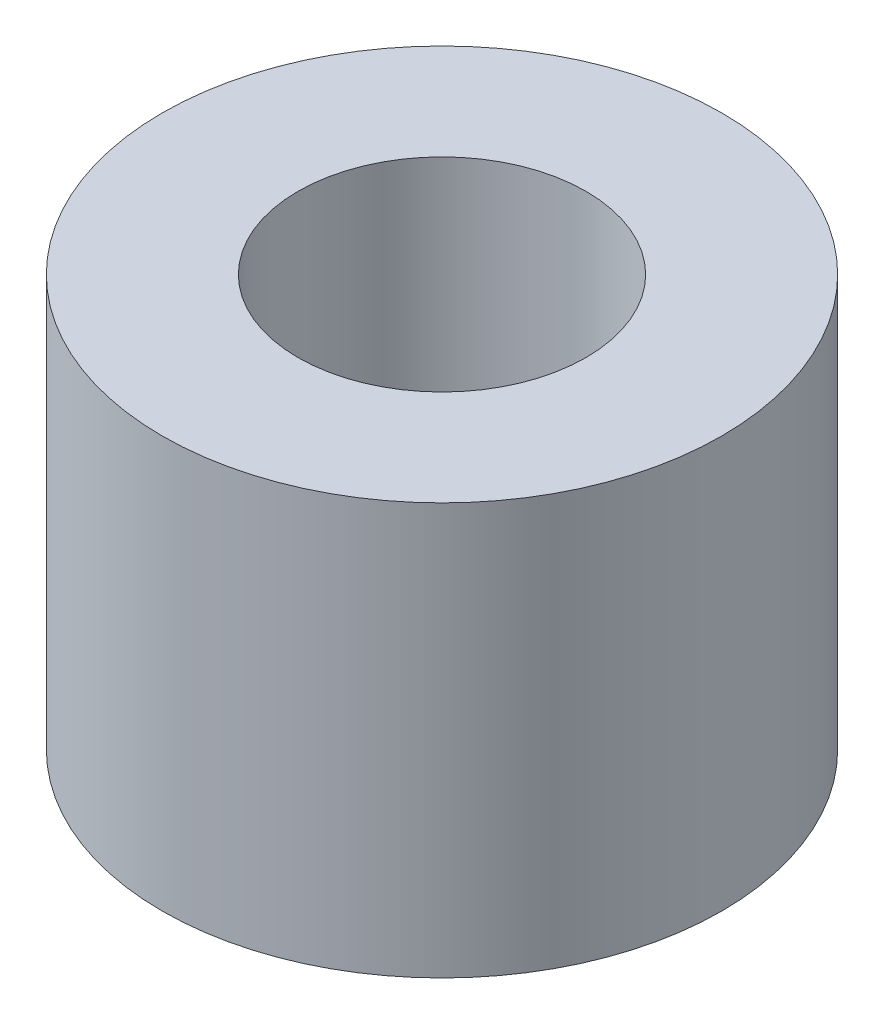
ISO-10303-21;
HEADER;
FILE_DESCRIPTION(('STEP AP214'),'2;1');
FILE_NAME('part.step','',(''),(''),'','','');
FILE_SCHEMA(('AUTOMOTIVE_DESIGN { 1 0 10303 214 1 1 1 1 }'));
ENDSEC;
DATA;
#1=APPLICATION_CONTEXT('core data for automotive mechanical design processes');
#2=APPLICATION_PROTOCOL_DEFINITION('international standard','automotive_design',2000,#1);
#3=PRODUCT_CONTEXT('',#1,'mechanical');
#4=PRODUCT('Part','Part','',(#3));
#5=PRODUCT_RELATED_PRODUCT_CATEGORY('part','',(#4));
#6=PRODUCT_DEFINITION_FORMATION('','',#4);
#7=PRODUCT_DEFINITION_CONTEXT('part definition',#1,'design');
#8=PRODUCT_DEFINITION('design','',#6,#7);
#9=PRODUCT_DEFINITION_SHAPE('','',#8);
#10=(LENGTH_UNIT() NAMED_UNIT(*) SI_UNIT(.MILLI.,.METRE.));
#11=(NAMED_UNIT(*) PLANE_ANGLE_UNIT() SI_UNIT($,.RADIAN.));
#12=(NAMED_UNIT(*) SI_UNIT($,.STERADIAN.) SOLID_ANGLE_UNIT());
#13=UNCERTAINTY_MEASURE_WITH_UNIT(LENGTH_MEASURE(1.E-05),#10,'distance_accuracy_value','');
#14=(GEOMETRIC_REPRESENTATION_CONTEXT(3) GLOBAL_UNCERTAINTY_ASSIGNED_CONTEXT((#13)) GLOBAL_UNIT_ASSIGNED_CONTEXT((#10,
#11,#12)) REPRESENTATION_CONTEXT('',''));
#15=CARTESIAN_POINT('',(0.,0.,0.));
#16=DIRECTION('',(0.,0.,1.));
#17=DIRECTION('',(1.,0.,0.));
#18=AXIS2_PLACEMENT_3D('',#15,#16,#17);
#19=CARTESIAN_POINT('',(0.,5.,0.));
#20=DIRECTION('',(0.,1.,0.));
#21=DIRECTION('',(0.,0.,1.));
#22=AXIS2_PLACEMENT_3D('',#19,#20,#21);
#23=PLANE('',#22);
#24=CARTESIAN_POINT('',(0.,5.,0.));
#25=DIRECTION('',(0.,1.,0.));
#26=DIRECTION('',(0.,0.,1.));
#27=AXIS2_PLACEMENT_3D('',#24,#25,#26);
#28=CIRCLE('',#27,3.4);
#29=CARTESIAN_POINT('',(0.,5.,3.4));
#30=VERTEX_POINT('',#29);
#31=EDGE_CURVE('E10',#30,#30,#28,.T.);
#32=ORIENTED_EDGE('',*,*,#31,.T.);
#33=EDGE_LOOP('',(#32));
#34=FACE_BOUND('',#33,.T.);
#35=CARTESIAN_POINT('',(0.,5.,0.));
#36=DIRECTION('',(0.,1.,0.));
#37=DIRECTION('',(0.,0.,1.));
#38=AXIS2_PLACEMENT_3D('',#35,#36,#37);
#39=CIRCLE('',#38,1.75);
#40=CARTESIAN_POINT('',(0.,5.,1.75));
#41=VERTEX_POINT('',#40);
#42=EDGE_CURVE('E56',#41,#41,#39,.T.);
#43=ORIENTED_EDGE('',*,*,#42,.F.);
#44=EDGE_LOOP('',(#43));
#45=FACE_BOUND('',#44,.T.);
#46=ADVANCED_FACE('F43',(#34,#45),#23,.T.);
#47=CARTESIAN_POINT('',(0.,0.,0.));
#48=DIRECTION('',(0.,1.,0.));
#49=DIRECTION('',(0.,0.,1.));
#50=AXIS2_PLACEMENT_3D('',#47,#48,#49);
#51=PLANE('',#50);
#52=CARTESIAN_POINT('',(0.,0.,0.));
#53=DIRECTION('',(0.,1.,0.));
#54=DIRECTION('',(0.,0.,1.));
#55=AXIS2_PLACEMENT_3D('',#52,#53,#54);
#56=CIRCLE('',#55,3.4);
#57=CARTESIAN_POINT('',(0.,0.,3.4));
#58=VERTEX_POINT('',#57);
#59=EDGE_CURVE('E47',#58,#58,#56,.T.);
#60=ORIENTED_EDGE('',*,*,#59,.F.);
#61=EDGE_LOOP('',(#60));
#62=FACE_BOUND('',#61,.T.);
#63=CARTESIAN_POINT('',(0.,0.,0.));
#64=DIRECTION('',(0.,1.,0.));
#65=DIRECTION('',(0.,0.,1.));
#66=AXIS2_PLACEMENT_3D('',#63,#64,#65);
#67=CIRCLE('',#66,1.75);
#68=CARTESIAN_POINT('',(0.,0.,1.75));
#69=VERTEX_POINT('',#68);
#70=EDGE_CURVE('E58',#69,#69,#67,.T.);
#71=ORIENTED_EDGE('',*,*,#70,.T.);
#72=EDGE_LOOP('',(#71));
#73=FACE_BOUND('',#72,.T.);
#74=ADVANCED_FACE('F70',(#62,#73),#51,.F.);
#75=CARTESIAN_POINT('',(0.,5.,0.));
#76=DIRECTION('',(0.,-1.,0.));
#77=DIRECTION('',(0.,0.,-1.));
#78=AXIS2_PLACEMENT_3D('',#75,#76,#77);
#79=CYLINDRICAL_SURFACE('',#78,3.4);
#80=ORIENTED_EDGE('',*,*,#31,.F.);
#81=EDGE_LOOP('',(#80));
#82=FACE_BOUND('',#81,.T.);
#83=ORIENTED_EDGE('',*,*,#59,.T.);
#84=EDGE_LOOP('',(#83));
#85=FACE_BOUND('',#84,.T.);
#86=ADVANCED_FACE('F45',(#82,#85),#79,.T.);
#87=CARTESIAN_POINT('',(0.,5.,0.));
#88=DIRECTION('',(0.,-1.,0.));
#89=DIRECTION('',(0.,0.,-1.));
#90=AXIS2_PLACEMENT_3D('',#87,#88,#89);
#91=CYLINDRICAL_SURFACE('',#90,1.75);
#92=ORIENTED_EDGE('',*,*,#42,.T.);
#93=EDGE_LOOP('',(#92));
#94=FACE_BOUND('',#93,.T.);
#95=ORIENTED_EDGE('',*,*,#70,.F.);
#96=EDGE_LOOP('',(#95));
#97=FACE_BOUND('',#96,.T.);
#98=ADVANCED_FACE('F66',(#94,#97),#91,.F.);
#99=CLOSED_SHELL('',(#46,#74,#86,#98));
#100=MANIFOLD_SOLID_BREP('B2',#99);
#101=ADVANCED_BREP_SHAPE_REPRESENTATION('',(#18,#100),#14);
#102=SHAPE_DEFINITION_REPRESENTATION(#9,#101);
ENDSEC;
END-ISO-10303-21;
